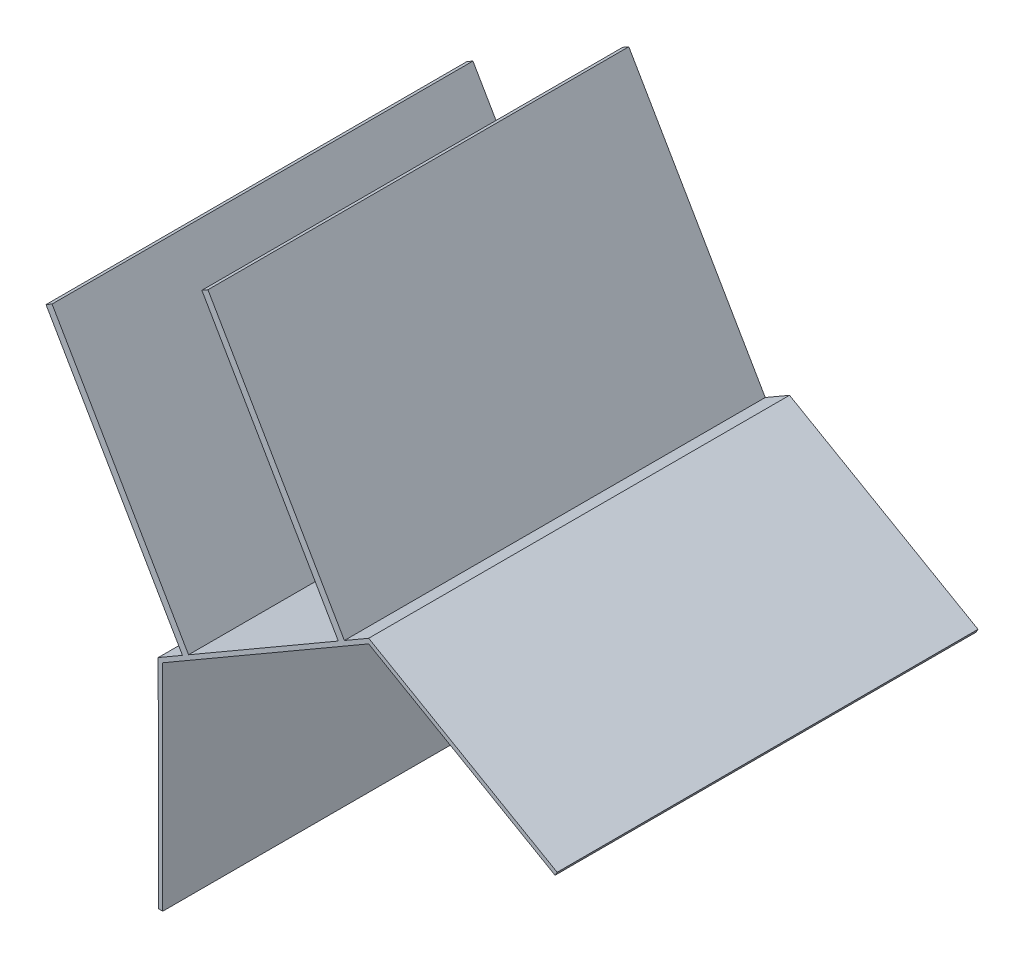
ISO-10303-21;
HEADER;
FILE_DESCRIPTION(('STEP AP214'),'2;1');
FILE_NAME('part.step','',(''),(''),'','','');
FILE_SCHEMA(('AUTOMOTIVE_DESIGN { 1 0 10303 214 1 1 1 1 }'));
ENDSEC;
DATA;
#1=APPLICATION_CONTEXT('core data for automotive mechanical design processes');
#2=APPLICATION_PROTOCOL_DEFINITION('international standard','automotive_design',2000,#1);
#3=PRODUCT_CONTEXT('',#1,'mechanical');
#4=PRODUCT('Part','Part','',(#3));
#5=PRODUCT_RELATED_PRODUCT_CATEGORY('part','',(#4));
#6=PRODUCT_DEFINITION_FORMATION('','',#4);
#7=PRODUCT_DEFINITION_CONTEXT('part definition',#1,'design');
#8=PRODUCT_DEFINITION('design','',#6,#7);
#9=PRODUCT_DEFINITION_SHAPE('','',#8);
#10=(LENGTH_UNIT() NAMED_UNIT(*) SI_UNIT(.MILLI.,.METRE.));
#11=(NAMED_UNIT(*) PLANE_ANGLE_UNIT() SI_UNIT($,.RADIAN.));
#12=(NAMED_UNIT(*) SI_UNIT($,.STERADIAN.) SOLID_ANGLE_UNIT());
#13=UNCERTAINTY_MEASURE_WITH_UNIT(LENGTH_MEASURE(1.E-05),#10,'distance_accuracy_value','');
#14=(GEOMETRIC_REPRESENTATION_CONTEXT(3) GLOBAL_UNCERTAINTY_ASSIGNED_CONTEXT((#13)) GLOBAL_UNIT_ASSIGNED_CONTEXT((#10,
#11,#12)) REPRESENTATION_CONTEXT('',''));
#15=CARTESIAN_POINT('',(0.,0.,0.));
#16=DIRECTION('',(0.,0.,1.));
#17=DIRECTION('',(1.,0.,0.));
#18=AXIS2_PLACEMENT_3D('',#15,#16,#17);
#19=CARTESIAN_POINT('',(-529.334093447902,913.551431110648,150.));
#20=DIRECTION('',(-0.501345446576402,0.865247215076193,0.));
#21=DIRECTION('',(-0.865247215076193,-0.501345446576402,0.));
#22=AXIS2_PLACEMENT_3D('',#19,#20,#21);
#23=PLANE('',#22);
#24=DIRECTION('',(0.865247215076193,0.501345446576402,0.));
#25=VECTOR('',#24,1.);
#26=CARTESIAN_POINT('',(-529.334093447902,913.551431110648,150.));
#27=LINE('',#26,#25);
#28=CARTESIAN_POINT('',(-605.658970562719,869.326926327183,150.));
#29=VERTEX_POINT('',#28);
#30=CARTESIAN_POINT('',(-588.354026261195,879.353835258711,150.));
#31=VERTEX_POINT('',#30);
#32=EDGE_CURVE('E213',#29,#31,#27,.T.);
#33=ORIENTED_EDGE('',*,*,#32,.T.);
#34=DIRECTION('',(0.,0.,1.));
#35=VECTOR('',#34,1.);
#36=CARTESIAN_POINT('',(-588.354026261196,879.353835258711,-150.));
#37=LINE('',#36,#35);
#38=CARTESIAN_POINT('',(-588.354026261196,879.353835258711,-150.));
#39=VERTEX_POINT('',#38);
#40=EDGE_CURVE('E174',#39,#31,#37,.T.);
#41=ORIENTED_EDGE('',*,*,#40,.F.);
#42=DIRECTION('',(0.865247215076193,0.501345446576402,0.));
#43=VECTOR('',#42,1.);
#44=CARTESIAN_POINT('',(-529.334093447902,913.551431110648,-150.));
#45=LINE('',#44,#43);
#46=CARTESIAN_POINT('',(-605.658970562719,869.326926327183,-150.));
#47=VERTEX_POINT('',#46);
#48=EDGE_CURVE('E236',#47,#39,#45,.T.);
#49=ORIENTED_EDGE('',*,*,#48,.F.);
#50=DIRECTION('',(0.,0.,-1.));
#51=VECTOR('',#50,1.);
#52=CARTESIAN_POINT('',(-605.658970562719,869.326926327183,150.));
#53=LINE('',#52,#51);
#54=EDGE_CURVE('E258',#29,#47,#53,.T.);
#55=ORIENTED_EDGE('',*,*,#54,.F.);
#56=EDGE_LOOP('',(#33,#41,#49,#55));
#57=FACE_BOUND('',#56,.T.);
#58=ADVANCED_FACE('F36',(#57),#23,.T.);
#59=CARTESIAN_POINT('',(-584.027790185814,881.860562491593,-150.));
#60=VERTEX_POINT('',#59);
#61=CARTESIAN_POINT('',(-477.253300681141,943.728319117628,-150.));
#62=VERTEX_POINT('',#61);
#63=EDGE_CURVE('E240',#60,#62,#45,.T.);
#64=ORIENTED_EDGE('',*,*,#63,.F.);
#65=DIRECTION('',(0.,0.,-1.));
#66=VECTOR('',#65,1.);
#67=CARTESIAN_POINT('',(-584.027790185815,881.860562491593,-150.));
#68=LINE('',#67,#66);
#69=CARTESIAN_POINT('',(-584.027790185815,881.860562491593,150.));
#70=VERTEX_POINT('',#69);
#71=EDGE_CURVE('E170',#70,#60,#68,.T.);
#72=ORIENTED_EDGE('',*,*,#71,.F.);
#73=CARTESIAN_POINT('',(-477.253300681141,943.728319117628,150.));
#74=VERTEX_POINT('',#73);
#75=EDGE_CURVE('E216',#70,#74,#27,.T.);
#76=ORIENTED_EDGE('',*,*,#75,.T.);
#77=DIRECTION('',(0.,0.,1.));
#78=VECTOR('',#77,1.);
#79=CARTESIAN_POINT('',(-477.253300681141,943.728319117628,-150.));
#80=LINE('',#79,#78);
#81=EDGE_CURVE('E177',#62,#74,#80,.T.);
#82=ORIENTED_EDGE('',*,*,#81,.F.);
#83=EDGE_LOOP('',(#64,#72,#76,#82));
#84=FACE_BOUND('',#83,.T.);
#85=ADVANCED_FACE('F312',(#84),#23,.T.);
#86=CARTESIAN_POINT('',(-472.92706460576,946.235046350509,-150.));
#87=VERTEX_POINT('',#86);
#88=CARTESIAN_POINT('',(-455.622120304236,956.261955282037,-150.));
#89=VERTEX_POINT('',#88);
#90=EDGE_CURVE('E235',#87,#89,#45,.T.);
#91=ORIENTED_EDGE('',*,*,#90,.F.);
#92=DIRECTION('',(0.,0.,-1.));
#93=VECTOR('',#92,1.);
#94=CARTESIAN_POINT('',(-472.92706460576,946.23504635051,-150.));
#95=LINE('',#94,#93);
#96=CARTESIAN_POINT('',(-472.92706460576,946.23504635051,150.));
#97=VERTEX_POINT('',#96);
#98=EDGE_CURVE('E59',#97,#87,#95,.T.);
#99=ORIENTED_EDGE('',*,*,#98,.F.);
#100=CARTESIAN_POINT('',(-455.622120304236,956.261955282037,150.));
#101=VERTEX_POINT('',#100);
#102=EDGE_CURVE('E212',#97,#101,#27,.T.);
#103=ORIENTED_EDGE('',*,*,#102,.T.);
#104=DIRECTION('',(0.,0.,-1.));
#105=VECTOR('',#104,1.);
#106=CARTESIAN_POINT('',(-455.622120304236,956.261955282037,150.));
#107=LINE('',#106,#105);
#108=EDGE_CURVE('E260',#101,#89,#107,.T.);
#109=ORIENTED_EDGE('',*,*,#108,.T.);
#110=EDGE_LOOP('',(#91,#99,#103,#109));
#111=FACE_BOUND('',#110,.T.);
#112=ADVANCED_FACE('F275',(#111),#23,.T.);
#113=CARTESIAN_POINT('',(298.541533198217,518.923634133479,150.));
#114=DIRECTION('',(0.498672519084214,0.866790469900428,0.));
#115=DIRECTION('',(-0.866790469900428,0.498672519084214,0.));
#116=AXIS2_PLACEMENT_3D('',#113,#114,#115);
#117=PLANE('',#116);
#118=DIRECTION('',(0.866790469900428,-0.498672519084214,0.));
#119=VECTOR('',#118,1.);
#120=CARTESIAN_POINT('',(298.541533198217,518.923634133479,-150.));
#121=LINE('',#120,#119);
#122=CARTESIAN_POINT('',(-455.616774380978,952.79783567149,-150.));
#123=VERTEX_POINT('',#122);
#124=CARTESIAN_POINT('',(-322.765615026922,876.367343414283,-150.));
#125=VERTEX_POINT('',#124);
#126=EDGE_CURVE('E203',#123,#125,#121,.T.);
#127=ORIENTED_EDGE('',*,*,#126,.T.);
#128=DIRECTION('',(0.,0.,-1.));
#129=VECTOR('',#128,1.);
#130=CARTESIAN_POINT('',(-322.765615026922,876.367343414283,150.));
#131=LINE('',#130,#129);
#132=CARTESIAN_POINT('',(-322.765615026922,876.367343414283,150.));
#133=VERTEX_POINT('',#132);
#134=EDGE_CURVE('E11',#133,#125,#131,.T.);
#135=ORIENTED_EDGE('',*,*,#134,.F.);
#136=DIRECTION('',(0.866790469900428,-0.498672519084214,0.));
#137=VECTOR('',#136,1.);
#138=CARTESIAN_POINT('',(298.541533198217,518.923634133479,150.));
#139=LINE('',#138,#137);
#140=CARTESIAN_POINT('',(-455.616774380978,952.79783567149,150.));
#141=VERTEX_POINT('',#140);
#142=EDGE_CURVE('E204',#141,#133,#139,.T.);
#143=ORIENTED_EDGE('',*,*,#142,.F.);
#144=DIRECTION('',(0.,0.,-1.));
#145=VECTOR('',#144,1.);
#146=CARTESIAN_POINT('',(-455.616774380978,952.79783567149,150.));
#147=LINE('',#146,#145);
#148=EDGE_CURVE('E226',#141,#123,#147,.T.);
#149=ORIENTED_EDGE('',*,*,#148,.T.);
#150=EDGE_LOOP('',(#127,#135,#143,#149));
#151=FACE_BOUND('',#150,.T.);
#152=ADVANCED_FACE('F38',(#151),#117,.F.);
#153=CARTESIAN_POINT('',(-621.307148225138,357.443709280794,150.));
#154=DIRECTION('',(-0.866790469900433,0.498672519084205,0.));
#155=DIRECTION('',(-0.498672519084205,-0.866790469900433,0.));
#156=AXIS2_PLACEMENT_3D('',#153,#154,#155);
#157=PLANE('',#156);
#158=DIRECTION('',(0.498672519084205,0.866790469900433,0.));
#159=VECTOR('',#158,1.);
#160=CARTESIAN_POINT('',(-621.307148225138,357.443709280794,-150.));
#161=LINE('',#160,#159);
#162=CARTESIAN_POINT('',(-321.26959746967,878.967714823984,-150.));
#163=VERTEX_POINT('',#162);
#164=EDGE_CURVE('E229',#125,#163,#161,.T.);
#165=ORIENTED_EDGE('',*,*,#164,.T.);
#166=DIRECTION('',(0.,0.,-1.));
#167=VECTOR('',#166,1.);
#168=CARTESIAN_POINT('',(-321.26959746967,878.967714823984,150.));
#169=LINE('',#168,#167);
#170=CARTESIAN_POINT('',(-321.26959746967,878.967714823984,150.));
#171=VERTEX_POINT('',#170);
#172=EDGE_CURVE('E44',#171,#163,#169,.T.);
#173=ORIENTED_EDGE('',*,*,#172,.F.);
#174=DIRECTION('',(0.498672519084205,0.866790469900433,0.));
#175=VECTOR('',#174,1.);
#176=CARTESIAN_POINT('',(-621.307148225138,357.443709280794,150.));
#177=LINE('',#176,#175);
#178=EDGE_CURVE('E206',#133,#171,#177,.T.);
#179=ORIENTED_EDGE('',*,*,#178,.F.);
#180=ORIENTED_EDGE('',*,*,#134,.T.);
#181=EDGE_LOOP('',(#165,#173,#179,#180));
#182=FACE_BOUND('',#181,.T.);
#183=ADVANCED_FACE('F269',(#182),#157,.F.);
#184=CARTESIAN_POINT('',(300.03755075547,521.52400554318,150.));
#185=DIRECTION('',(0.498672519084214,0.866790469900428,0.));
#186=DIRECTION('',(-0.866790469900428,0.498672519084214,0.));
#187=AXIS2_PLACEMENT_3D('',#184,#185,#186);
#188=PLANE('',#187);
#189=DIRECTION('',(0.866790469900428,-0.498672519084214,0.));
#190=VECTOR('',#189,1.);
#191=CARTESIAN_POINT('',(300.03755075547,521.52400554318,-150.));
#192=LINE('',#191,#190);
#193=EDGE_CURVE('E232',#89,#163,#192,.T.);
#194=ORIENTED_EDGE('',*,*,#193,.F.);
#195=ORIENTED_EDGE('',*,*,#108,.F.);
#196=DIRECTION('',(0.866790469900428,-0.498672519084214,0.));
#197=VECTOR('',#196,1.);
#198=CARTESIAN_POINT('',(300.03755075547,521.52400554318,150.));
#199=LINE('',#198,#197);
#200=EDGE_CURVE('E209',#101,#171,#199,.T.);
#201=ORIENTED_EDGE('',*,*,#200,.T.);
#202=ORIENTED_EDGE('',*,*,#172,.T.);
#203=EDGE_LOOP('',(#194,#195,#201,#202));
#204=FACE_BOUND('',#203,.T.);
#205=ADVANCED_FACE('F265',(#204),#188,.T.);
#206=CARTESIAN_POINT('',(-604.325597812315,-0.925927769958897,150.));
#207=DIRECTION('',(-0.999998826234128,-0.00153216525410867,0.));
#208=DIRECTION('',(0.00153216525410867,-0.999998826234128,0.));
#209=AXIS2_PLACEMENT_3D('',#206,#207,#208);
#210=PLANE('',#209);
#211=DIRECTION('',(-0.00153216525410867,0.999998826234128,0.));
#212=VECTOR('',#211,1.);
#213=CARTESIAN_POINT('',(-604.325597812315,-0.925927769958897,-150.));
#214=LINE('',#213,#212);
#215=CARTESIAN_POINT('',(-605.421491464646,714.331361265699,-150.));
#216=VERTEX_POINT('',#215);
#217=EDGE_CURVE('E239',#216,#47,#214,.T.);
#218=ORIENTED_EDGE('',*,*,#217,.F.);
#219=DIRECTION('',(0.,0.,-1.));
#220=VECTOR('',#219,1.);
#221=CARTESIAN_POINT('',(-605.421491464646,714.331361265699,150.));
#222=LINE('',#221,#220);
#223=CARTESIAN_POINT('',(-605.421491464646,714.331361265699,150.));
#224=VERTEX_POINT('',#223);
#225=EDGE_CURVE('E256',#224,#216,#222,.T.);
#226=ORIENTED_EDGE('',*,*,#225,.F.);
#227=DIRECTION('',(-0.00153216525410867,0.999998826234128,0.));
#228=VECTOR('',#227,1.);
#229=CARTESIAN_POINT('',(-604.325597812315,-0.925927769958897,150.));
#230=LINE('',#229,#228);
#231=EDGE_CURVE('E215',#224,#29,#230,.T.);
#232=ORIENTED_EDGE('',*,*,#231,.T.);
#233=ORIENTED_EDGE('',*,*,#54,.T.);
#234=EDGE_LOOP('',(#218,#226,#232,#233));
#235=FACE_BOUND('',#234,.T.);
#236=ADVANCED_FACE('F297',(#235),#210,.T.);
#237=CARTESIAN_POINT('',(0.,714.331361265699,150.));
#238=DIRECTION('',(0.,-1.,0.));
#239=DIRECTION('',(0.,0.,-1.));
#240=AXIS2_PLACEMENT_3D('',#237,#238,#239);
#241=PLANE('',#240);
#242=DIRECTION('',(-1.,0.,0.));
#243=VECTOR('',#242,1.);
#244=CARTESIAN_POINT('',(0.,714.331361265699,-150.));
#245=LINE('',#244,#243);
#246=CARTESIAN_POINT('',(-602.421487943344,714.331361265699,-150.));
#247=VERTEX_POINT('',#246);
#248=EDGE_CURVE('E243',#247,#216,#245,.T.);
#249=ORIENTED_EDGE('',*,*,#248,.F.);
#250=DIRECTION('',(0.,0.,-1.));
#251=VECTOR('',#250,1.);
#252=CARTESIAN_POINT('',(-602.421487943344,714.331361265699,150.));
#253=LINE('',#252,#251);
#254=CARTESIAN_POINT('',(-602.421487943344,714.331361265699,150.));
#255=VERTEX_POINT('',#254);
#256=EDGE_CURVE('E254',#255,#247,#253,.T.);
#257=ORIENTED_EDGE('',*,*,#256,.F.);
#258=DIRECTION('',(-1.,0.,0.));
#259=VECTOR('',#258,1.);
#260=CARTESIAN_POINT('',(0.,714.331361265699,150.));
#261=LINE('',#260,#259);
#262=EDGE_CURVE('E219',#255,#224,#261,.T.);
#263=ORIENTED_EDGE('',*,*,#262,.T.);
#264=ORIENTED_EDGE('',*,*,#225,.T.);
#265=EDGE_LOOP('',(#249,#257,#263,#264));
#266=FACE_BOUND('',#265,.T.);
#267=ADVANCED_FACE('F293',(#266),#241,.T.);
#268=CARTESIAN_POINT('',(-601.325601333613,-0.92133127419667,150.));
#269=DIRECTION('',(-0.999998826234128,-0.00153216525410884,0.));
#270=DIRECTION('',(0.00153216525410884,-0.999998826234128,0.));
#271=AXIS2_PLACEMENT_3D('',#268,#269,#270);
#272=PLANE('',#271);
#273=DIRECTION('',(-0.00153216525410884,0.999998826234128,0.));
#274=VECTOR('',#273,1.);
#275=CARTESIAN_POINT('',(-601.325601333613,-0.92133127419667,-150.));
#276=LINE('',#275,#274);
#277=CARTESIAN_POINT('',(-602.656320363734,867.599518288146,-150.));
#278=VERTEX_POINT('',#277);
#279=EDGE_CURVE('E246',#247,#278,#276,.T.);
#280=ORIENTED_EDGE('',*,*,#279,.T.);
#281=DIRECTION('',(0.,0.,-1.));
#282=VECTOR('',#281,1.);
#283=CARTESIAN_POINT('',(-602.656320363734,867.599518288146,150.));
#284=LINE('',#283,#282);
#285=CARTESIAN_POINT('',(-602.656320363734,867.599518288146,150.));
#286=VERTEX_POINT('',#285);
#287=EDGE_CURVE('E251',#286,#278,#284,.T.);
#288=ORIENTED_EDGE('',*,*,#287,.F.);
#289=DIRECTION('',(-0.00153216525410884,0.999998826234128,0.));
#290=VECTOR('',#289,1.);
#291=CARTESIAN_POINT('',(-601.325601333613,-0.92133127419667,150.));
#292=LINE('',#291,#290);
#293=EDGE_CURVE('E222',#255,#286,#292,.T.);
#294=ORIENTED_EDGE('',*,*,#293,.F.);
#295=ORIENTED_EDGE('',*,*,#256,.T.);
#296=EDGE_LOOP('',(#280,#288,#294,#295));
#297=FACE_BOUND('',#296,.T.);
#298=ADVANCED_FACE('F290',(#297),#272,.F.);
#299=CARTESIAN_POINT('',(-527.830057108174,910.955689465419,150.));
#300=DIRECTION('',(-0.501345446576403,0.865247215076193,0.));
#301=DIRECTION('',(-0.865247215076193,-0.501345446576403,0.));
#302=AXIS2_PLACEMENT_3D('',#299,#300,#301);
#303=PLANE('',#302);
#304=DIRECTION('',(0.865247215076193,0.501345446576403,0.));
#305=VECTOR('',#304,1.);
#306=CARTESIAN_POINT('',(-527.830057108174,910.955689465419,-150.));
#307=LINE('',#306,#305);
#308=EDGE_CURVE('E207',#278,#123,#307,.T.);
#309=ORIENTED_EDGE('',*,*,#308,.T.);
#310=ORIENTED_EDGE('',*,*,#148,.F.);
#311=DIRECTION('',(0.865247215076193,0.501345446576403,0.));
#312=VECTOR('',#311,1.);
#313=CARTESIAN_POINT('',(-527.830057108174,910.955689465419,150.));
#314=LINE('',#313,#312);
#315=EDGE_CURVE('E224',#286,#141,#314,.T.);
#316=ORIENTED_EDGE('',*,*,#315,.F.);
#317=ORIENTED_EDGE('',*,*,#287,.T.);
#318=EDGE_LOOP('',(#309,#310,#316,#317));
#319=FACE_BOUND('',#318,.T.);
#320=ADVANCED_FACE('F286',(#319),#303,.F.);
#321=CARTESIAN_POINT('',(0.,0.,150.));
#322=DIRECTION('',(0.,0.,1.));
#323=DIRECTION('',(1.,0.,0.));
#324=AXIS2_PLACEMENT_3D('',#321,#322,#323);
#325=PLANE('',#324);
#326=ORIENTED_EDGE('',*,*,#142,.T.);
#327=ORIENTED_EDGE('',*,*,#178,.T.);
#328=ORIENTED_EDGE('',*,*,#200,.F.);
#329=ORIENTED_EDGE('',*,*,#102,.F.);
#330=DIRECTION('',(0.501345446576402,-0.865247215076193,0.));
#331=VECTOR('',#330,1.);
#332=CARTESIAN_POINT('',(-570.208135059445,1114.12761596389,150.));
#333=LINE('',#332,#331);
#334=CARTESIAN_POINT('',(-570.208135059445,1114.12761596389,150.));
#335=VERTEX_POINT('',#334);
#336=EDGE_CURVE('E190',#335,#97,#333,.T.);
#337=ORIENTED_EDGE('',*,*,#336,.F.);
#338=DIRECTION('',(0.865247215076191,0.501345446576406,0.));
#339=VECTOR('',#338,1.);
#340=CARTESIAN_POINT('',(-570.208135059445,1114.12761596389,150.));
#341=LINE('',#340,#339);
#342=CARTESIAN_POINT('',(-574.534371134826,1111.62088873101,150.));
#343=VERTEX_POINT('',#342);
#344=EDGE_CURVE('E189',#343,#335,#341,.T.);
#345=ORIENTED_EDGE('',*,*,#344,.F.);
#346=DIRECTION('',(0.501345446576402,-0.865247215076193,0.));
#347=VECTOR('',#346,1.);
#348=CARTESIAN_POINT('',(-574.534371134826,1111.62088873101,150.));
#349=LINE('',#348,#347);
#350=EDGE_CURVE('E195',#343,#74,#349,.T.);
#351=ORIENTED_EDGE('',*,*,#350,.T.);
#352=ORIENTED_EDGE('',*,*,#75,.F.);
#353=DIRECTION('',(0.501345446576402,-0.865247215076193,0.));
#354=VECTOR('',#353,1.);
#355=CARTESIAN_POINT('',(-681.308860639499,1049.75313210498,150.));
#356=LINE('',#355,#354);
#357=CARTESIAN_POINT('',(-681.308860639499,1049.75313210498,150.));
#358=VERTEX_POINT('',#357);
#359=EDGE_CURVE('E159',#358,#70,#356,.T.);
#360=ORIENTED_EDGE('',*,*,#359,.F.);
#361=DIRECTION('',(0.865247215076201,0.501345446576389,0.));
#362=VECTOR('',#361,1.);
#363=CARTESIAN_POINT('',(-685.635096714881,1047.2464048721,150.));
#364=LINE('',#363,#362);
#365=CARTESIAN_POINT('',(-685.635096714881,1047.2464048721,150.));
#366=VERTEX_POINT('',#365);
#367=EDGE_CURVE('E150',#366,#358,#364,.T.);
#368=ORIENTED_EDGE('',*,*,#367,.F.);
#369=DIRECTION('',(0.501345446576402,-0.865247215076193,0.));
#370=VECTOR('',#369,1.);
#371=CARTESIAN_POINT('',(-685.635096714881,1047.2464048721,150.));
#372=LINE('',#371,#370);
#373=EDGE_CURVE('E156',#366,#31,#372,.T.);
#374=ORIENTED_EDGE('',*,*,#373,.T.);
#375=ORIENTED_EDGE('',*,*,#32,.F.);
#376=ORIENTED_EDGE('',*,*,#231,.F.);
#377=ORIENTED_EDGE('',*,*,#262,.F.);
#378=ORIENTED_EDGE('',*,*,#293,.T.);
#379=ORIENTED_EDGE('',*,*,#315,.T.);
#380=EDGE_LOOP('',(#326,#327,#328,#329,#337,#345,#351,#352,#360,#368,#374,#375,#376,#377,#378,#379));
#381=FACE_BOUND('',#380,.T.);
#382=ADVANCED_FACE('F153',(#381),#325,.T.);
#383=CARTESIAN_POINT('',(0.,0.,-150.));
#384=DIRECTION('',(0.,0.,1.));
#385=DIRECTION('',(1.,0.,0.));
#386=AXIS2_PLACEMENT_3D('',#383,#384,#385);
#387=PLANE('',#386);
#388=ORIENTED_EDGE('',*,*,#126,.F.);
#389=ORIENTED_EDGE('',*,*,#308,.F.);
#390=ORIENTED_EDGE('',*,*,#279,.F.);
#391=ORIENTED_EDGE('',*,*,#248,.T.);
#392=ORIENTED_EDGE('',*,*,#217,.T.);
#393=ORIENTED_EDGE('',*,*,#48,.T.);
#394=DIRECTION('',(0.501345446576402,-0.865247215076193,0.));
#395=VECTOR('',#394,1.);
#396=CARTESIAN_POINT('',(-685.635096714881,1047.2464048721,-150.));
#397=LINE('',#396,#395);
#398=CARTESIAN_POINT('',(-685.635096714881,1047.2464048721,-150.));
#399=VERTEX_POINT('',#398);
#400=EDGE_CURVE('E305',#399,#39,#397,.T.);
#401=ORIENTED_EDGE('',*,*,#400,.F.);
#402=DIRECTION('',(-0.865247215076191,-0.501345446576406,0.));
#403=VECTOR('',#402,1.);
#404=CARTESIAN_POINT('',(-685.635096714881,1047.2464048721,-150.));
#405=LINE('',#404,#403);
#406=CARTESIAN_POINT('',(-681.3088606395,1049.75313210498,-150.));
#407=VERTEX_POINT('',#406);
#408=EDGE_CURVE('E167',#407,#399,#405,.T.);
#409=ORIENTED_EDGE('',*,*,#408,.F.);
#410=DIRECTION('',(0.501345446576402,-0.865247215076193,0.));
#411=VECTOR('',#410,1.);
#412=CARTESIAN_POINT('',(-681.3088606395,1049.75313210498,-150.));
#413=LINE('',#412,#411);
#414=EDGE_CURVE('E51',#407,#60,#413,.T.);
#415=ORIENTED_EDGE('',*,*,#414,.T.);
#416=ORIENTED_EDGE('',*,*,#63,.T.);
#417=DIRECTION('',(0.501345446576402,-0.865247215076193,0.));
#418=VECTOR('',#417,1.);
#419=CARTESIAN_POINT('',(-574.534371134826,1111.62088873101,-150.));
#420=LINE('',#419,#418);
#421=CARTESIAN_POINT('',(-574.534371134826,1111.62088873101,-150.));
#422=VERTEX_POINT('',#421);
#423=EDGE_CURVE('E198',#422,#62,#420,.T.);
#424=ORIENTED_EDGE('',*,*,#423,.F.);
#425=DIRECTION('',(-0.865247215076191,-0.501345446576406,0.));
#426=VECTOR('',#425,1.);
#427=CARTESIAN_POINT('',(-570.208135059445,1114.12761596389,-150.));
#428=LINE('',#427,#426);
#429=CARTESIAN_POINT('',(-570.208135059445,1114.12761596389,-150.));
#430=VERTEX_POINT('',#429);
#431=EDGE_CURVE('E185',#430,#422,#428,.T.);
#432=ORIENTED_EDGE('',*,*,#431,.F.);
#433=DIRECTION('',(0.501345446576402,-0.865247215076193,0.));
#434=VECTOR('',#433,1.);
#435=CARTESIAN_POINT('',(-570.208135059445,1114.12761596389,-150.));
#436=LINE('',#435,#434);
#437=EDGE_CURVE('E201',#430,#87,#436,.T.);
#438=ORIENTED_EDGE('',*,*,#437,.T.);
#439=ORIENTED_EDGE('',*,*,#90,.T.);
#440=ORIENTED_EDGE('',*,*,#193,.T.);
#441=ORIENTED_EDGE('',*,*,#164,.F.);
#442=EDGE_LOOP('',(#388,#389,#390,#391,#392,#393,#401,#409,#415,#416,#424,#432,#438,#439,#440,#441));
#443=FACE_BOUND('',#442,.T.);
#444=ADVANCED_FACE('F272',(#443),#387,.F.);
#445=CARTESIAN_POINT('',(-570.208135059445,1114.12761596389,-150.));
#446=DIRECTION('',(-0.865247215076193,-0.501345446576402,0.));
#447=DIRECTION('',(0.501345446576402,-0.865247215076193,0.));
#448=AXIS2_PLACEMENT_3D('',#445,#446,#447);
#449=PLANE('',#448);
#450=ORIENTED_EDGE('',*,*,#98,.T.);
#451=ORIENTED_EDGE('',*,*,#437,.F.);
#452=DIRECTION('',(0.,0.,-1.));
#453=VECTOR('',#452,1.);
#454=CARTESIAN_POINT('',(-570.208135059445,1114.12761596389,-150.));
#455=LINE('',#454,#453);
#456=EDGE_CURVE('E182',#335,#430,#455,.T.);
#457=ORIENTED_EDGE('',*,*,#456,.F.);
#458=ORIENTED_EDGE('',*,*,#336,.T.);
#459=EDGE_LOOP('',(#450,#451,#457,#458));
#460=FACE_BOUND('',#459,.T.);
#461=ADVANCED_FACE('F322',(#460),#449,.F.);
#462=CARTESIAN_POINT('',(-574.534371134826,1111.62088873101,-150.));
#463=DIRECTION('',(0.865247215076193,0.501345446576402,0.));
#464=DIRECTION('',(-0.501345446576402,0.865247215076193,0.));
#465=AXIS2_PLACEMENT_3D('',#462,#463,#464);
#466=PLANE('',#465);
#467=ORIENTED_EDGE('',*,*,#81,.T.);
#468=ORIENTED_EDGE('',*,*,#350,.F.);
#469=DIRECTION('',(0.,0.,1.));
#470=VECTOR('',#469,1.);
#471=CARTESIAN_POINT('',(-574.534371134826,1111.62088873101,-150.));
#472=LINE('',#471,#470);
#473=EDGE_CURVE('E187',#422,#343,#472,.T.);
#474=ORIENTED_EDGE('',*,*,#473,.F.);
#475=ORIENTED_EDGE('',*,*,#423,.T.);
#476=EDGE_LOOP('',(#467,#468,#474,#475));
#477=FACE_BOUND('',#476,.T.);
#478=ADVANCED_FACE('F316',(#477),#466,.F.);
#479=CARTESIAN_POINT('',(-626.615163901592,1081.44400072403,0.));
#480=DIRECTION('',(0.501345446576406,-0.865247215076191,0.));
#481=DIRECTION('',(0.865247215076191,0.501345446576406,0.));
#482=AXIS2_PLACEMENT_3D('',#479,#480,#481);
#483=PLANE('',#482);
#484=ORIENTED_EDGE('',*,*,#456,.T.);
#485=ORIENTED_EDGE('',*,*,#431,.T.);
#486=ORIENTED_EDGE('',*,*,#473,.T.);
#487=ORIENTED_EDGE('',*,*,#344,.T.);
#488=EDGE_LOOP('',(#484,#485,#486,#487));
#489=FACE_BOUND('',#488,.T.);
#490=ADVANCED_FACE('F320',(#489),#483,.F.);
#491=CARTESIAN_POINT('',(-685.635096714881,1047.2464048721,-150.));
#492=DIRECTION('',(0.865247215076193,0.501345446576402,0.));
#493=DIRECTION('',(-0.501345446576402,0.865247215076193,0.));
#494=AXIS2_PLACEMENT_3D('',#491,#492,#493);
#495=PLANE('',#494);
#496=ORIENTED_EDGE('',*,*,#40,.T.);
#497=ORIENTED_EDGE('',*,*,#373,.F.);
#498=DIRECTION('',(0.,0.,1.));
#499=VECTOR('',#498,1.);
#500=CARTESIAN_POINT('',(-685.635096714881,1047.2464048721,-150.));
#501=LINE('',#500,#499);
#502=EDGE_CURVE('E163',#399,#366,#501,.T.);
#503=ORIENTED_EDGE('',*,*,#502,.F.);
#504=ORIENTED_EDGE('',*,*,#400,.T.);
#505=EDGE_LOOP('',(#496,#497,#503,#504));
#506=FACE_BOUND('',#505,.T.);
#507=ADVANCED_FACE('F172',(#506),#495,.F.);
#508=CARTESIAN_POINT('',(-681.3088606395,1049.75313210498,-150.));
#509=DIRECTION('',(-0.865247215076193,-0.501345446576402,0.));
#510=DIRECTION('',(0.501345446576402,-0.865247215076193,0.));
#511=AXIS2_PLACEMENT_3D('',#508,#509,#510);
#512=PLANE('',#511);
#513=ORIENTED_EDGE('',*,*,#71,.T.);
#514=ORIENTED_EDGE('',*,*,#414,.F.);
#515=DIRECTION('',(0.,0.,-1.));
#516=VECTOR('',#515,1.);
#517=CARTESIAN_POINT('',(-681.3088606395,1049.75313210498,-150.));
#518=LINE('',#517,#516);
#519=EDGE_CURVE('E162',#358,#407,#518,.T.);
#520=ORIENTED_EDGE('',*,*,#519,.F.);
#521=ORIENTED_EDGE('',*,*,#359,.T.);
#522=EDGE_LOOP('',(#513,#514,#520,#521));
#523=FACE_BOUND('',#522,.T.);
#524=ADVANCED_FACE('F307',(#523),#512,.F.);
#525=CARTESIAN_POINT('',(-626.615163901574,1081.44400072404,-1.42188978244461E-13));
#526=DIRECTION('',(-0.501345446576389,0.865247215076201,0.));
#527=DIRECTION('',(-0.865247215076201,-0.501345446576389,0.));
#528=AXIS2_PLACEMENT_3D('',#525,#526,#527);
#529=PLANE('',#528);
#530=ORIENTED_EDGE('',*,*,#502,.T.);
#531=ORIENTED_EDGE('',*,*,#367,.T.);
#532=ORIENTED_EDGE('',*,*,#519,.T.);
#533=ORIENTED_EDGE('',*,*,#408,.T.);
#534=EDGE_LOOP('',(#530,#531,#532,#533));
#535=FACE_BOUND('',#534,.T.);
#536=ADVANCED_FACE('F166',(#535),#529,.T.);
#537=CLOSED_SHELL('',(#58,#85,#112,#152,#183,#205,#236,#267,#298,#320,#382,#444,#461,#478,#490,
#507,#524,#536));
#538=MANIFOLD_SOLID_BREP('B2',#537);
#539=ADVANCED_BREP_SHAPE_REPRESENTATION('',(#18,#538),#14);
#540=SHAPE_DEFINITION_REPRESENTATION(#9,#539);
ENDSEC;
END-ISO-10303-21;
